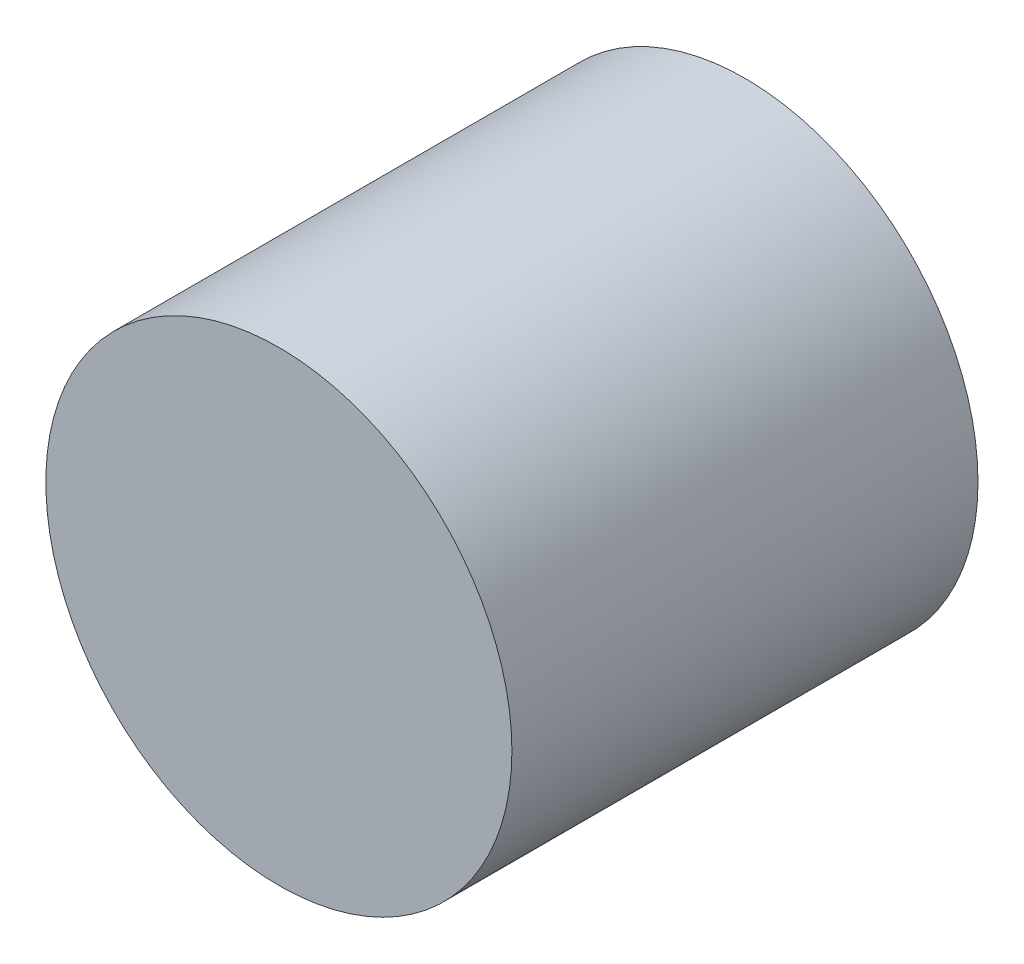
ISO-10303-21;
HEADER;
FILE_DESCRIPTION(('STEP AP214'),'2;1');
FILE_NAME('part.step','',(''),(''),'','','');
FILE_SCHEMA(('AUTOMOTIVE_DESIGN { 1 0 10303 214 1 1 1 1 }'));
ENDSEC;
DATA;
#1=APPLICATION_CONTEXT('core data for automotive mechanical design processes');
#2=APPLICATION_PROTOCOL_DEFINITION('international standard','automotive_design',2000,#1);
#3=PRODUCT_CONTEXT('',#1,'mechanical');
#4=PRODUCT('Part','Part','',(#3));
#5=PRODUCT_RELATED_PRODUCT_CATEGORY('part','',(#4));
#6=PRODUCT_DEFINITION_FORMATION('','',#4);
#7=PRODUCT_DEFINITION_CONTEXT('part definition',#1,'design');
#8=PRODUCT_DEFINITION('design','',#6,#7);
#9=PRODUCT_DEFINITION_SHAPE('','',#8);
#10=(LENGTH_UNIT() NAMED_UNIT(*) SI_UNIT(.MILLI.,.METRE.));
#11=(NAMED_UNIT(*) PLANE_ANGLE_UNIT() SI_UNIT($,.RADIAN.));
#12=(NAMED_UNIT(*) SI_UNIT($,.STERADIAN.) SOLID_ANGLE_UNIT());
#13=UNCERTAINTY_MEASURE_WITH_UNIT(LENGTH_MEASURE(1.E-05),#10,'distance_accuracy_value','');
#14=(GEOMETRIC_REPRESENTATION_CONTEXT(3) GLOBAL_UNCERTAINTY_ASSIGNED_CONTEXT((#13)) GLOBAL_UNIT_ASSIGNED_CONTEXT((#10,
#11,#12)) REPRESENTATION_CONTEXT('',''));
#15=CARTESIAN_POINT('',(0.,0.,0.));
#16=DIRECTION('',(0.,0.,1.));
#17=DIRECTION('',(1.,0.,0.));
#18=AXIS2_PLACEMENT_3D('',#15,#16,#17);
#19=CARTESIAN_POINT('',(0.,0.,-3.));
#20=DIRECTION('',(0.,0.,1.));
#21=DIRECTION('',(1.,0.,0.));
#22=AXIS2_PLACEMENT_3D('',#19,#20,#21);
#23=CYLINDRICAL_SURFACE('',#22,1.5);
#24=CARTESIAN_POINT('',(0.,0.,-3.));
#25=DIRECTION('',(0.,0.,1.));
#26=DIRECTION('',(1.,0.,0.));
#27=AXIS2_PLACEMENT_3D('',#24,#25,#26);
#28=CIRCLE('',#27,1.5);
#29=CARTESIAN_POINT('',(1.5,0.,-3.));
#30=VERTEX_POINT('',#29);
#31=EDGE_CURVE('E10',#30,#30,#28,.T.);
#32=ORIENTED_EDGE('',*,*,#31,.T.);
#33=EDGE_LOOP('',(#32));
#34=FACE_BOUND('',#33,.T.);
#35=CARTESIAN_POINT('',(0.,0.,0.));
#36=DIRECTION('',(0.,0.,1.));
#37=DIRECTION('',(1.,0.,0.));
#38=AXIS2_PLACEMENT_3D('',#35,#36,#37);
#39=CIRCLE('',#38,1.5);
#40=CARTESIAN_POINT('',(1.5,0.,0.));
#41=VERTEX_POINT('',#40);
#42=EDGE_CURVE('E37',#41,#41,#39,.T.);
#43=ORIENTED_EDGE('',*,*,#42,.F.);
#44=EDGE_LOOP('',(#43));
#45=FACE_BOUND('',#44,.T.);
#46=ADVANCED_FACE('F40',(#34,#45),#23,.T.);
#47=CARTESIAN_POINT('',(0.,0.,-3.));
#48=DIRECTION('',(0.,0.,1.));
#49=DIRECTION('',(1.,0.,0.));
#50=AXIS2_PLACEMENT_3D('',#47,#48,#49);
#51=PLANE('',#50);
#52=ORIENTED_EDGE('',*,*,#31,.F.);
#53=EDGE_LOOP('',(#52));
#54=FACE_BOUND('',#53,.T.);
#55=ADVANCED_FACE('F55',(#54),#51,.F.);
#56=CARTESIAN_POINT('',(0.,0.,0.));
#57=DIRECTION('',(0.,0.,1.));
#58=DIRECTION('',(1.,0.,0.));
#59=AXIS2_PLACEMENT_3D('',#56,#57,#58);
#60=PLANE('',#59);
#61=ORIENTED_EDGE('',*,*,#42,.T.);
#62=EDGE_LOOP('',(#61));
#63=FACE_BOUND('',#62,.T.);
#64=ADVANCED_FACE('F47',(#63),#60,.T.);
#65=CLOSED_SHELL('',(#46,#55,#64));
#66=MANIFOLD_SOLID_BREP('B2',#65);
#67=ADVANCED_BREP_SHAPE_REPRESENTATION('',(#18,#66),#14);
#68=SHAPE_DEFINITION_REPRESENTATION(#9,#67);
ENDSEC;
END-ISO-10303-21;
